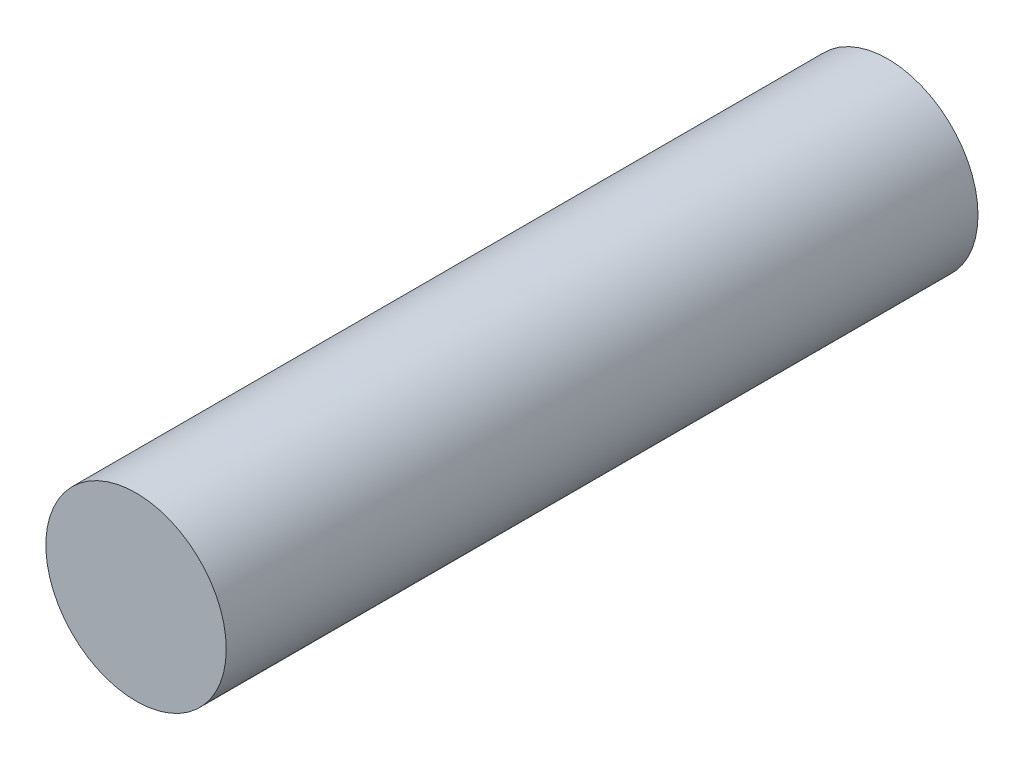
ISO-10303-21;
HEADER;
FILE_DESCRIPTION(('STEP AP214'),'2;1');
FILE_NAME('part.step','',(''),(''),'','','');
FILE_SCHEMA(('AUTOMOTIVE_DESIGN { 1 0 10303 214 1 1 1 1 }'));
ENDSEC;
DATA;
#1=APPLICATION_CONTEXT('core data for automotive mechanical design processes');
#2=APPLICATION_PROTOCOL_DEFINITION('international standard','automotive_design',2000,#1);
#3=PRODUCT_CONTEXT('',#1,'mechanical');
#4=PRODUCT('Part','Part','',(#3));
#5=PRODUCT_RELATED_PRODUCT_CATEGORY('part','',(#4));
#6=PRODUCT_DEFINITION_FORMATION('','',#4);
#7=PRODUCT_DEFINITION_CONTEXT('part definition',#1,'design');
#8=PRODUCT_DEFINITION('design','',#6,#7);
#9=PRODUCT_DEFINITION_SHAPE('','',#8);
#10=(LENGTH_UNIT() NAMED_UNIT(*) SI_UNIT(.MILLI.,.METRE.));
#11=(NAMED_UNIT(*) PLANE_ANGLE_UNIT() SI_UNIT($,.RADIAN.));
#12=(NAMED_UNIT(*) SI_UNIT($,.STERADIAN.) SOLID_ANGLE_UNIT());
#13=UNCERTAINTY_MEASURE_WITH_UNIT(LENGTH_MEASURE(1.E-05),#10,'distance_accuracy_value','');
#14=(GEOMETRIC_REPRESENTATION_CONTEXT(3) GLOBAL_UNCERTAINTY_ASSIGNED_CONTEXT((#13)) GLOBAL_UNIT_ASSIGNED_CONTEXT((#10,
#11,#12)) REPRESENTATION_CONTEXT('',''));
#15=CARTESIAN_POINT('',(0.,0.,0.));
#16=DIRECTION('',(0.,0.,1.));
#17=DIRECTION('',(1.,0.,0.));
#18=AXIS2_PLACEMENT_3D('',#15,#16,#17);
#19=CARTESIAN_POINT('',(0.,0.,12.5));
#20=DIRECTION('',(0.,0.,-1.));
#21=DIRECTION('',(-1.,0.,0.));
#22=AXIS2_PLACEMENT_3D('',#19,#20,#21);
#23=CYLINDRICAL_SURFACE('',#22,1.5);
#24=CARTESIAN_POINT('',(0.,0.,12.5));
#25=DIRECTION('',(0.,0.,1.));
#26=DIRECTION('',(1.,0.,0.));
#27=AXIS2_PLACEMENT_3D('',#24,#25,#26);
#28=CIRCLE('',#27,1.5);
#29=CARTESIAN_POINT('',(1.5,0.,12.5));
#30=VERTEX_POINT('',#29);
#31=EDGE_CURVE('E11',#30,#30,#28,.T.);
#32=ORIENTED_EDGE('',*,*,#31,.F.);
#33=EDGE_LOOP('',(#32));
#34=FACE_BOUND('',#33,.T.);
#35=CARTESIAN_POINT('',(0.,0.,0.));
#36=DIRECTION('',(0.,0.,1.));
#37=DIRECTION('',(1.,0.,0.));
#38=AXIS2_PLACEMENT_3D('',#35,#36,#37);
#39=CIRCLE('',#38,1.5);
#40=CARTESIAN_POINT('',(1.5,0.,0.));
#41=VERTEX_POINT('',#40);
#42=EDGE_CURVE('E44',#41,#41,#39,.T.);
#43=ORIENTED_EDGE('',*,*,#42,.T.);
#44=EDGE_LOOP('',(#43));
#45=FACE_BOUND('',#44,.T.);
#46=ADVANCED_FACE('F41',(#34,#45),#23,.T.);
#47=CARTESIAN_POINT('',(0.,0.,12.5));
#48=DIRECTION('',(0.,0.,1.));
#49=DIRECTION('',(1.,0.,0.));
#50=AXIS2_PLACEMENT_3D('',#47,#48,#49);
#51=PLANE('',#50);
#52=ORIENTED_EDGE('',*,*,#31,.T.);
#53=EDGE_LOOP('',(#52));
#54=FACE_BOUND('',#53,.T.);
#55=ADVANCED_FACE('F57',(#54),#51,.T.);
#56=CARTESIAN_POINT('',(0.,0.,0.));
#57=DIRECTION('',(0.,0.,1.));
#58=DIRECTION('',(1.,0.,0.));
#59=AXIS2_PLACEMENT_3D('',#56,#57,#58);
#60=PLANE('',#59);
#61=ORIENTED_EDGE('',*,*,#42,.F.);
#62=EDGE_LOOP('',(#61));
#63=FACE_BOUND('',#62,.T.);
#64=ADVANCED_FACE('F55',(#63),#60,.F.);
#65=CLOSED_SHELL('',(#46,#55,#64));
#66=MANIFOLD_SOLID_BREP('B2',#65);
#67=ADVANCED_BREP_SHAPE_REPRESENTATION('',(#18,#66),#14);
#68=SHAPE_DEFINITION_REPRESENTATION(#9,#67);
ENDSEC;
END-ISO-10303-21;
